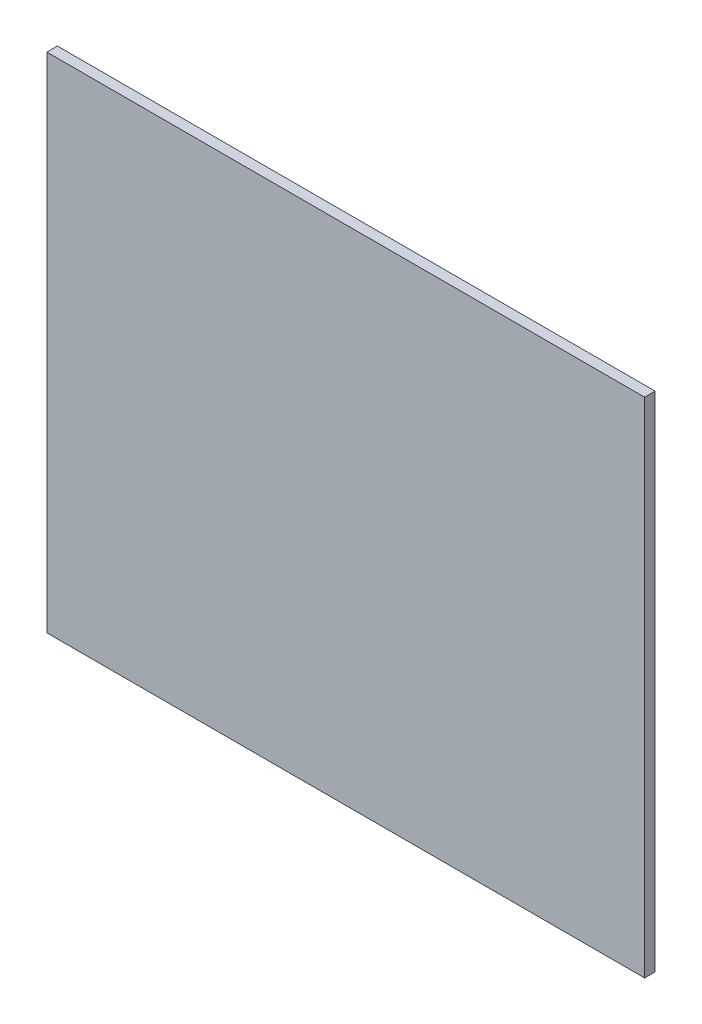
ISO-10303-21;
HEADER;
FILE_DESCRIPTION(('STEP AP214'),'2;1');
FILE_NAME('part.step','',(''),(''),'','','');
FILE_SCHEMA(('AUTOMOTIVE_DESIGN { 1 0 10303 214 1 1 1 1 }'));
ENDSEC;
DATA;
#1=APPLICATION_CONTEXT('core data for automotive mechanical design processes');
#2=APPLICATION_PROTOCOL_DEFINITION('international standard','automotive_design',2000,#1);
#3=PRODUCT_CONTEXT('',#1,'mechanical');
#4=PRODUCT('Part','Part','',(#3));
#5=PRODUCT_RELATED_PRODUCT_CATEGORY('part','',(#4));
#6=PRODUCT_DEFINITION_FORMATION('','',#4);
#7=PRODUCT_DEFINITION_CONTEXT('part definition',#1,'design');
#8=PRODUCT_DEFINITION('design','',#6,#7);
#9=PRODUCT_DEFINITION_SHAPE('','',#8);
#10=(LENGTH_UNIT() NAMED_UNIT(*) SI_UNIT(.MILLI.,.METRE.));
#11=(NAMED_UNIT(*) PLANE_ANGLE_UNIT() SI_UNIT($,.RADIAN.));
#12=(NAMED_UNIT(*) SI_UNIT($,.STERADIAN.) SOLID_ANGLE_UNIT());
#13=UNCERTAINTY_MEASURE_WITH_UNIT(LENGTH_MEASURE(1.E-05),#10,'distance_accuracy_value','');
#14=(GEOMETRIC_REPRESENTATION_CONTEXT(3) GLOBAL_UNCERTAINTY_ASSIGNED_CONTEXT((#13)) GLOBAL_UNIT_ASSIGNED_CONTEXT((#10,
#11,#12)) REPRESENTATION_CONTEXT('',''));
#15=CARTESIAN_POINT('',(0.,0.,0.));
#16=DIRECTION('',(0.,0.,1.));
#17=DIRECTION('',(1.,0.,0.));
#18=AXIS2_PLACEMENT_3D('',#15,#16,#17);
#19=CARTESIAN_POINT('',(241.894250388181,-231.74669032224,10.));
#20=DIRECTION('',(-1.,0.,0.));
#21=DIRECTION('',(0.,0.,1.));
#22=AXIS2_PLACEMENT_3D('',#19,#20,#21);
#23=PLANE('',#22);
#24=DIRECTION('',(0.,1.,0.));
#25=VECTOR('',#24,1.);
#26=CARTESIAN_POINT('',(241.894250388181,-231.74669032224,0.));
#27=LINE('',#26,#25);
#28=CARTESIAN_POINT('',(241.894250388181,-231.74669032224,0.));
#29=VERTEX_POINT('',#28);
#30=CARTESIAN_POINT('',(241.894250388181,246.696005622965,0.));
#31=VERTEX_POINT('',#30);
#32=EDGE_CURVE('E115',#29,#31,#27,.T.);
#33=ORIENTED_EDGE('',*,*,#32,.T.);
#34=DIRECTION('',(0.,0.,-1.));
#35=VECTOR('',#34,1.);
#36=CARTESIAN_POINT('',(241.894250388181,246.696005622965,10.));
#37=LINE('',#36,#35);
#38=CARTESIAN_POINT('',(241.894250388181,246.696005622965,10.));
#39=VERTEX_POINT('',#38);
#40=EDGE_CURVE('E11',#39,#31,#37,.T.);
#41=ORIENTED_EDGE('',*,*,#40,.F.);
#42=DIRECTION('',(0.,1.,0.));
#43=VECTOR('',#42,1.);
#44=CARTESIAN_POINT('',(241.894250388181,-231.74669032224,10.));
#45=LINE('',#44,#43);
#46=CARTESIAN_POINT('',(241.894250388181,-231.74669032224,10.));
#47=VERTEX_POINT('',#46);
#48=EDGE_CURVE('E92',#47,#39,#45,.T.);
#49=ORIENTED_EDGE('',*,*,#48,.F.);
#50=DIRECTION('',(0.,0.,-1.));
#51=VECTOR('',#50,1.);
#52=CARTESIAN_POINT('',(241.894250388181,-231.74669032224,10.));
#53=LINE('',#52,#51);
#54=EDGE_CURVE('E107',#47,#29,#53,.T.);
#55=ORIENTED_EDGE('',*,*,#54,.T.);
#56=EDGE_LOOP('',(#33,#41,#49,#55));
#57=FACE_BOUND('',#56,.T.);
#58=ADVANCED_FACE('F43',(#57),#23,.F.);
#59=CARTESIAN_POINT('',(241.894250388181,246.696005622965,10.));
#60=DIRECTION('',(0.,-1.,0.));
#61=DIRECTION('',(0.,0.,-1.));
#62=AXIS2_PLACEMENT_3D('',#59,#60,#61);
#63=PLANE('',#62);
#64=DIRECTION('',(-1.,0.,0.));
#65=VECTOR('',#64,1.);
#66=CARTESIAN_POINT('',(241.894250388181,246.696005622965,0.));
#67=LINE('',#66,#65);
#68=CARTESIAN_POINT('',(-326.767391306805,246.696005622965,0.));
#69=VERTEX_POINT('',#68);
#70=EDGE_CURVE('E99',#31,#69,#67,.T.);
#71=ORIENTED_EDGE('',*,*,#70,.T.);
#72=DIRECTION('',(0.,0.,-1.));
#73=VECTOR('',#72,1.);
#74=CARTESIAN_POINT('',(-326.767391306805,246.696005622965,10.));
#75=LINE('',#74,#73);
#76=CARTESIAN_POINT('',(-326.767391306805,246.696005622965,10.));
#77=VERTEX_POINT('',#76);
#78=EDGE_CURVE('E55',#77,#69,#75,.T.);
#79=ORIENTED_EDGE('',*,*,#78,.F.);
#80=DIRECTION('',(-1.,0.,0.));
#81=VECTOR('',#80,1.);
#82=CARTESIAN_POINT('',(241.894250388181,246.696005622965,10.));
#83=LINE('',#82,#81);
#84=EDGE_CURVE('E89',#39,#77,#83,.T.);
#85=ORIENTED_EDGE('',*,*,#84,.F.);
#86=ORIENTED_EDGE('',*,*,#40,.T.);
#87=EDGE_LOOP('',(#71,#79,#85,#86));
#88=FACE_BOUND('',#87,.T.);
#89=ADVANCED_FACE('F97',(#88),#63,.F.);
#90=CARTESIAN_POINT('',(-326.767391306805,-231.74669032224,10.));
#91=DIRECTION('',(1.,0.,0.));
#92=DIRECTION('',(0.,0.,-1.));
#93=AXIS2_PLACEMENT_3D('',#90,#91,#92);
#94=PLANE('',#93);
#95=DIRECTION('',(0.,-1.,0.));
#96=VECTOR('',#95,1.);
#97=CARTESIAN_POINT('',(-326.767391306805,-231.74669032224,0.));
#98=LINE('',#97,#96);
#99=CARTESIAN_POINT('',(-326.767391306805,-231.74669032224,0.));
#100=VERTEX_POINT('',#99);
#101=EDGE_CURVE('E79',#69,#100,#98,.T.);
#102=ORIENTED_EDGE('',*,*,#101,.T.);
#103=DIRECTION('',(0.,0.,-1.));
#104=VECTOR('',#103,1.);
#105=CARTESIAN_POINT('',(-326.767391306805,-231.74669032224,10.));
#106=LINE('',#105,#104);
#107=CARTESIAN_POINT('',(-326.767391306805,-231.74669032224,10.));
#108=VERTEX_POINT('',#107);
#109=EDGE_CURVE('E105',#108,#100,#106,.T.);
#110=ORIENTED_EDGE('',*,*,#109,.F.);
#111=DIRECTION('',(0.,-1.,0.));
#112=VECTOR('',#111,1.);
#113=CARTESIAN_POINT('',(-326.767391306805,-231.74669032224,10.));
#114=LINE('',#113,#112);
#115=EDGE_CURVE('E91',#77,#108,#114,.T.);
#116=ORIENTED_EDGE('',*,*,#115,.F.);
#117=ORIENTED_EDGE('',*,*,#78,.T.);
#118=EDGE_LOOP('',(#102,#110,#116,#117));
#119=FACE_BOUND('',#118,.T.);
#120=ADVANCED_FACE('F103',(#119),#94,.F.);
#121=CARTESIAN_POINT('',(241.894250388181,-231.74669032224,10.));
#122=DIRECTION('',(0.,1.,0.));
#123=DIRECTION('',(0.,0.,1.));
#124=AXIS2_PLACEMENT_3D('',#121,#122,#123);
#125=PLANE('',#124);
#126=DIRECTION('',(1.,0.,0.));
#127=VECTOR('',#126,1.);
#128=CARTESIAN_POINT('',(241.894250388181,-231.74669032224,0.));
#129=LINE('',#128,#127);
#130=EDGE_CURVE('E83',#100,#29,#129,.T.);
#131=ORIENTED_EDGE('',*,*,#130,.T.);
#132=ORIENTED_EDGE('',*,*,#54,.F.);
#133=DIRECTION('',(1.,0.,0.));
#134=VECTOR('',#133,1.);
#135=CARTESIAN_POINT('',(241.894250388181,-231.74669032224,10.));
#136=LINE('',#135,#134);
#137=EDGE_CURVE('E58',#108,#47,#136,.T.);
#138=ORIENTED_EDGE('',*,*,#137,.F.);
#139=ORIENTED_EDGE('',*,*,#109,.T.);
#140=EDGE_LOOP('',(#131,#132,#138,#139));
#141=FACE_BOUND('',#140,.T.);
#142=ADVANCED_FACE('F127',(#141),#125,.F.);
#143=CARTESIAN_POINT('',(0.,0.,10.));
#144=DIRECTION('',(0.,0.,1.));
#145=DIRECTION('',(1.,0.,0.));
#146=AXIS2_PLACEMENT_3D('',#143,#144,#145);
#147=PLANE('',#146);
#148=ORIENTED_EDGE('',*,*,#48,.T.);
#149=ORIENTED_EDGE('',*,*,#84,.T.);
#150=ORIENTED_EDGE('',*,*,#115,.T.);
#151=ORIENTED_EDGE('',*,*,#137,.T.);
#152=EDGE_LOOP('',(#148,#149,#150,#151));
#153=FACE_BOUND('',#152,.T.);
#154=ADVANCED_FACE('F93',(#153),#147,.T.);
#155=CARTESIAN_POINT('',(0.,0.,0.));
#156=DIRECTION('',(0.,0.,1.));
#157=DIRECTION('',(1.,0.,0.));
#158=AXIS2_PLACEMENT_3D('',#155,#156,#157);
#159=PLANE('',#158);
#160=ORIENTED_EDGE('',*,*,#32,.F.);
#161=ORIENTED_EDGE('',*,*,#130,.F.);
#162=ORIENTED_EDGE('',*,*,#101,.F.);
#163=ORIENTED_EDGE('',*,*,#70,.F.);
#164=EDGE_LOOP('',(#160,#161,#162,#163));
#165=FACE_BOUND('',#164,.T.);
#166=ADVANCED_FACE('F129',(#165),#159,.F.);
#167=CLOSED_SHELL('',(#58,#89,#120,#142,#154,#166));
#168=MANIFOLD_SOLID_BREP('B2',#167);
#169=ADVANCED_BREP_SHAPE_REPRESENTATION('',(#18,#168),#14);
#170=SHAPE_DEFINITION_REPRESENTATION(#9,#169);
ENDSEC;
END-ISO-10303-21;
